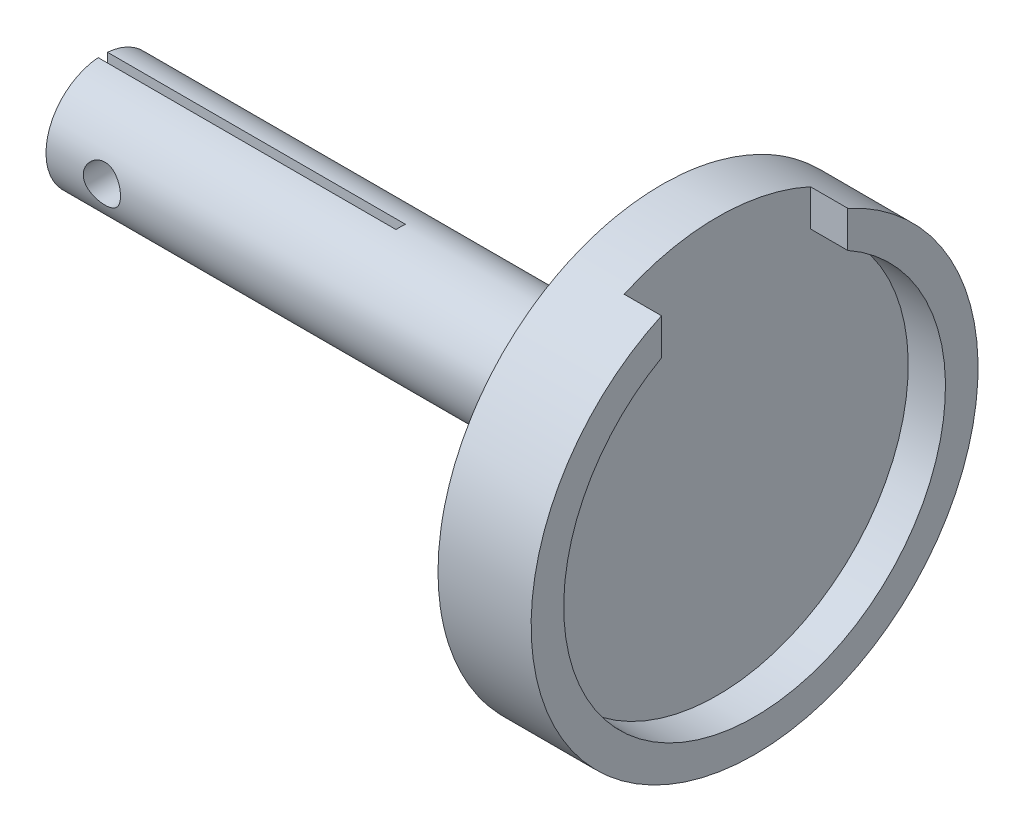
ISO-10303-21;
HEADER;
FILE_DESCRIPTION(('STEP AP214'),'2;1');
FILE_NAME('part.step','',(''),(''),'','','');
FILE_SCHEMA(('AUTOMOTIVE_DESIGN { 1 0 10303 214 1 1 1 1 }'));
ENDSEC;
DATA;
#1=APPLICATION_CONTEXT('core data for automotive mechanical design processes');
#2=APPLICATION_PROTOCOL_DEFINITION('international standard','automotive_design',2000,#1);
#3=PRODUCT_CONTEXT('',#1,'mechanical');
#4=PRODUCT('Part','Part','',(#3));
#5=PRODUCT_RELATED_PRODUCT_CATEGORY('part','',(#4));
#6=PRODUCT_DEFINITION_FORMATION('','',#4);
#7=PRODUCT_DEFINITION_CONTEXT('part definition',#1,'design');
#8=PRODUCT_DEFINITION('design','',#6,#7);
#9=PRODUCT_DEFINITION_SHAPE('','',#8);
#10=(LENGTH_UNIT() NAMED_UNIT(*) SI_UNIT(.MILLI.,.METRE.));
#11=(NAMED_UNIT(*) PLANE_ANGLE_UNIT() SI_UNIT($,.RADIAN.));
#12=(NAMED_UNIT(*) SI_UNIT($,.STERADIAN.) SOLID_ANGLE_UNIT());
#13=UNCERTAINTY_MEASURE_WITH_UNIT(LENGTH_MEASURE(1.E-05),#10,'distance_accuracy_value','');
#14=(GEOMETRIC_REPRESENTATION_CONTEXT(3) GLOBAL_UNCERTAINTY_ASSIGNED_CONTEXT((#13)) GLOBAL_UNIT_ASSIGNED_CONTEXT((#10,
#11,#12)) REPRESENTATION_CONTEXT('',''));
#15=CARTESIAN_POINT('',(0.,0.,0.));
#16=DIRECTION('',(0.,0.,1.));
#17=DIRECTION('',(1.,0.,0.));
#18=AXIS2_PLACEMENT_3D('',#15,#16,#17);
#19=CARTESIAN_POINT('',(35.,0.,0.));
#20=DIRECTION('',(-1.,0.,0.));
#21=DIRECTION('',(0.,0.,1.));
#22=AXIS2_PLACEMENT_3D('',#19,#20,#21);
#23=CYLINDRICAL_SURFACE('',#22,12.);
#24=CARTESIAN_POINT('',(30.,0.,-12.));
#25=CARTESIAN_POINT('',(30.,-1.57079632525588,-12.));
#26=CARTESIAN_POINT('',(30.,-3.14097461373017,-11.687672119433));
#27=CARTESIAN_POINT('',(30.,-6.04342776303202,-10.4854366608379));
#28=CARTESIAN_POINT('',(30.,-7.37456064078693,-9.59600210769022));
#29=CARTESIAN_POINT('',(30.,-9.59600210769027,-7.37456064078688));
#30=CARTESIAN_POINT('',(30.,-10.4854366608379,-6.04342776303051));
#31=CARTESIAN_POINT('',(30.,-11.687672119433,-3.14097461373161));
#32=CARTESIAN_POINT('',(30.,-12.,-1.57079632525766));
#33=CARTESIAN_POINT('',(30.,-12.,1.57079632525762));
#34=CARTESIAN_POINT('',(30.,-11.687672119433,3.14097461373239));
#35=CARTESIAN_POINT('',(30.,-10.4854366608379,6.0434277630298));
#36=CARTESIAN_POINT('',(30.,-9.59600210769122,7.3745606407874));
#37=CARTESIAN_POINT('',(30.,-7.37456064078593,9.59600210768973));
#38=CARTESIAN_POINT('',(30.,-6.04342776303099,10.4854366608399));
#39=CARTESIAN_POINT('',(30.,-3.14097461373114,11.687672119431));
#40=CARTESIAN_POINT('',(30.,-1.57079632525763,12.));
#41=CARTESIAN_POINT('',(30.,1.57079632525764,12.));
#42=CARTESIAN_POINT('',(30.,3.14097461373043,11.687672119431));
#43=CARTESIAN_POINT('',(30.,6.04342776303176,10.4854366608399));
#44=CARTESIAN_POINT('',(30.,7.3745606407874,9.59600210769122));
#45=CARTESIAN_POINT('',(30.,9.59600210768973,7.37456064078593));
#46=CARTESIAN_POINT('',(30.,10.4854366608399,6.04342776303101));
#47=CARTESIAN_POINT('',(30.,11.687672119431,3.14097461373116));
#48=CARTESIAN_POINT('',(30.,12.,1.57079632525764));
#49=CARTESIAN_POINT('',(30.,12.,-1.57079632525764));
#50=CARTESIAN_POINT('',(30.,11.6876721194325,-3.14097461373189));
#51=CARTESIAN_POINT('',(30.,10.4854366608384,-6.04342776303026));
#52=CARTESIAN_POINT('',(30.,9.5960021076927,-7.37456064078593));
#53=CARTESIAN_POINT('',(30.,7.37456064078444,-9.59600210769122));
#54=CARTESIAN_POINT('',(30.,6.043427763031,-10.4854366608399));
#55=CARTESIAN_POINT('',(30.,3.14097461373115,-11.687672119431));
#56=CARTESIAN_POINT('',(30.,1.57079632525587,-12.));
#57=CARTESIAN_POINT('',(30.,0.,-12.));
#58=(BOUNDED_CURVE() B_SPLINE_CURVE(3,(#24,#25,#26,#27,#28,#29,#30,#31,#32,#33,#34,#35,#36,#37,
#38,#39,#40,#41,#42,#43,#44,#45,#46,#47,#48,#49,#50,#51,#52,#53,#54,#55,#56,#57),.UNSPECIFIED.,
.T.,.F.) B_SPLINE_CURVE_WITH_KNOTS((4,2,2,2,2,2,2,2,2,2,2,2,2,2,2,2,4),(0.,0.392699081698725,
0.785398163397448,1.17809724509617,1.5707963267949,1.96349540849362,2.35619449019234,
2.74889357189107,3.14159265358979,3.53429173528852,3.92699081698724,4.31968989868597,
4.71238898038469,5.10508806208341,5.49778714378214,5.89048622548086,6.28318530717959),
.UNSPECIFIED.) CURVE() GEOMETRIC_REPRESENTATION_ITEM() RATIONAL_B_SPLINE_CURVE((1.,1.,1.,1.,1.,
1.,1.,1.,1.,1.,1.,1.,1.,1.,1.,1.,1.,1.,1.,1.,1.,1.,1.,1.,1.,1.,1.,1.,1.,1.,1.,1.,1.,1.)) REPRESENTATION_ITEM(''));
#59=CARTESIAN_POINT('',(30.,0.,-12.));
#60=VERTEX_POINT('',#59);
#61=EDGE_CURVE('E135',#60,#60,#58,.F.);
#62=ORIENTED_EDGE('',*,*,#61,.T.);
#63=EDGE_LOOP('',(#62));
#64=FACE_BOUND('',#63,.T.);
#65=DIRECTION('',(-1.,0.,0.));
#66=VECTOR('',#65,1.);
#67=CARTESIAN_POINT('',(35.,10.9087121146357,-5.));
#68=LINE('',#67,#66);
#69=CARTESIAN_POINT('',(35.,10.9087121146357,-5.));
#70=VERTEX_POINT('',#69);
#71=CARTESIAN_POINT('',(33.,10.9087121146357,-5.));
#72=VERTEX_POINT('',#71);
#73=EDGE_CURVE('E133',#70,#72,#68,.T.);
#74=ORIENTED_EDGE('',*,*,#73,.F.);
#75=CARTESIAN_POINT('',(35.,0.,0.));
#76=DIRECTION('',(1.,0.,0.));
#77=DIRECTION('',(0.,0.,-1.));
#78=AXIS2_PLACEMENT_3D('',#75,#76,#77);
#79=CIRCLE('',#78,12.);
#80=CARTESIAN_POINT('',(35.,10.9087121146357,5.));
#81=VERTEX_POINT('',#80);
#82=EDGE_CURVE('E128',#81,#70,#79,.T.);
#83=ORIENTED_EDGE('',*,*,#82,.F.);
#84=DIRECTION('',(-1.,0.,0.));
#85=VECTOR('',#84,1.);
#86=CARTESIAN_POINT('',(35.,10.9087121146357,5.));
#87=LINE('',#86,#85);
#88=CARTESIAN_POINT('',(33.,10.9087121146357,5.));
#89=VERTEX_POINT('',#88);
#90=EDGE_CURVE('E113',#89,#81,#87,.F.);
#91=ORIENTED_EDGE('',*,*,#90,.F.);
#92=CARTESIAN_POINT('',(33.,0.,0.));
#93=DIRECTION('',(1.,0.,0.));
#94=DIRECTION('',(0.,0.,-1.));
#95=AXIS2_PLACEMENT_3D('',#92,#93,#94);
#96=CIRCLE('',#95,12.);
#97=EDGE_CURVE('E302',#72,#89,#96,.T.);
#98=ORIENTED_EDGE('',*,*,#97,.F.);
#99=EDGE_LOOP('',(#74,#83,#91,#98));
#100=FACE_BOUND('',#99,.T.);
#101=ADVANCED_FACE('F40',(#64,#100),#23,.T.);
#102=CARTESIAN_POINT('',(35.,0.,0.));
#103=DIRECTION('',(1.,0.,0.));
#104=DIRECTION('',(0.,0.,-1.));
#105=AXIS2_PLACEMENT_3D('',#102,#103,#104);
#106=PLANE('',#105);
#107=ORIENTED_EDGE('',*,*,#82,.T.);
#108=DIRECTION('',(0.,-1.,0.));
#109=VECTOR('',#108,1.);
#110=CARTESIAN_POINT('',(35.,27.,-5.));
#111=LINE('',#110,#109);
#112=CARTESIAN_POINT('',(35.,8.94776508408664,-5.));
#113=VERTEX_POINT('',#112);
#114=EDGE_CURVE('E307',#70,#113,#111,.T.);
#115=ORIENTED_EDGE('',*,*,#114,.T.);
#116=CARTESIAN_POINT('',(35.,0.,0.));
#117=DIRECTION('',(1.,0.,0.));
#118=DIRECTION('',(0.,0.,-1.));
#119=AXIS2_PLACEMENT_3D('',#116,#117,#118);
#120=CIRCLE('',#119,10.25);
#121=CARTESIAN_POINT('',(35.,8.94776508408664,5.));
#122=VERTEX_POINT('',#121);
#123=EDGE_CURVE('E130',#122,#113,#120,.T.);
#124=ORIENTED_EDGE('',*,*,#123,.F.);
#125=DIRECTION('',(0.,-1.,0.));
#126=VECTOR('',#125,1.);
#127=CARTESIAN_POINT('',(35.,27.,5.));
#128=LINE('',#127,#126);
#129=EDGE_CURVE('E62',#81,#122,#128,.T.);
#130=ORIENTED_EDGE('',*,*,#129,.F.);
#131=EDGE_LOOP('',(#107,#115,#124,#130));
#132=FACE_BOUND('',#131,.T.);
#133=ADVANCED_FACE('F126',(#132),#106,.T.);
#134=CARTESIAN_POINT('',(33.,0.,0.));
#135=DIRECTION('',(1.,0.,0.));
#136=DIRECTION('',(0.,0.,-1.));
#137=AXIS2_PLACEMENT_3D('',#134,#135,#136);
#138=CYLINDRICAL_SURFACE('',#137,10.25);
#139=DIRECTION('',(1.,0.,0.));
#140=VECTOR('',#139,1.);
#141=CARTESIAN_POINT('',(33.,8.94776508408664,-5.));
#142=LINE('',#141,#140);
#143=CARTESIAN_POINT('',(33.,8.94776508408664,-5.));
#144=VERTEX_POINT('',#143);
#145=EDGE_CURVE('E120',#144,#113,#142,.T.);
#146=ORIENTED_EDGE('',*,*,#145,.F.);
#147=CARTESIAN_POINT('',(33.,0.,0.));
#148=DIRECTION('',(1.,0.,0.));
#149=DIRECTION('',(0.,0.,-1.));
#150=AXIS2_PLACEMENT_3D('',#147,#148,#149);
#151=CIRCLE('',#150,10.25);
#152=CARTESIAN_POINT('',(33.,8.94776508408664,5.));
#153=VERTEX_POINT('',#152);
#154=EDGE_CURVE('E141',#153,#144,#151,.T.);
#155=ORIENTED_EDGE('',*,*,#154,.F.);
#156=DIRECTION('',(1.,0.,0.));
#157=VECTOR('',#156,1.);
#158=CARTESIAN_POINT('',(33.,8.94776508408664,5.));
#159=LINE('',#158,#157);
#160=EDGE_CURVE('E121',#122,#153,#159,.F.);
#161=ORIENTED_EDGE('',*,*,#160,.F.);
#162=ORIENTED_EDGE('',*,*,#123,.T.);
#163=EDGE_LOOP('',(#146,#155,#161,#162));
#164=FACE_BOUND('',#163,.T.);
#165=ADVANCED_FACE('F191',(#164),#138,.F.);
#166=CARTESIAN_POINT('',(30.,0.,0.));
#167=DIRECTION('',(-1.,0.,0.));
#168=DIRECTION('',(0.,0.,1.));
#169=AXIS2_PLACEMENT_3D('',#166,#167,#168);
#170=CYLINDRICAL_SURFACE('',#169,3.05);
#171=CARTESIAN_POINT('',(25.1114930704764,0.,-3.05));
#172=CARTESIAN_POINT('',(25.1114930704764,0.399244066002534,-3.05));
#173=CARTESIAN_POINT('',(25.1114930704764,0.798331047656877,-2.9706166636888));
#174=CARTESIAN_POINT('',(25.1114930704764,1.53603788977017,-2.66504848463005));
#175=CARTESIAN_POINT('',(25.1114930704764,1.87436749619847,-2.43898386903947));
#176=CARTESIAN_POINT('',(25.1114930704764,2.43898386903947,-1.87436749619847));
#177=CARTESIAN_POINT('',(25.1114930704764,2.66504848462992,-1.53603788977048));
#178=CARTESIAN_POINT('',(25.1114930704764,2.97061666368893,-0.798331047656558));
#179=CARTESIAN_POINT('',(25.1114930704764,3.05,-0.399244066002982));
#180=CARTESIAN_POINT('',(25.1114930704764,3.05,0.399244066002982));
#181=CARTESIAN_POINT('',(25.1114930704764,2.97061666368867,0.798331047657195));
#182=CARTESIAN_POINT('',(25.1114930704764,2.66504848463018,1.53603788976986));
#183=CARTESIAN_POINT('',(25.1114930704764,2.43898386903872,1.87436749619921));
#184=CARTESIAN_POINT('',(25.1114930704764,1.87436749619921,2.43898386903873));
#185=CARTESIAN_POINT('',(25.1114930704764,1.53603788977091,2.66504848462974));
#186=CARTESIAN_POINT('',(25.1114930704764,0.79833104765615,2.9706166636891));
#187=CARTESIAN_POINT('',(25.1114930704764,0.399244066002983,3.05));
#188=CARTESIAN_POINT('',(25.1114930704764,-0.399244066002982,3.05));
#189=CARTESIAN_POINT('',(25.1114930704764,-0.798331047656664,2.97061666368889));
#190=CARTESIAN_POINT('',(25.1114930704764,-1.53603788977037,2.66504848462996));
#191=CARTESIAN_POINT('',(25.1114930704764,-1.87436749619921,2.43898386903872));
#192=CARTESIAN_POINT('',(25.1114930704764,-2.43898386903873,1.87436749619921));
#193=CARTESIAN_POINT('',(25.1114930704764,-2.66504848462999,1.53603788977031));
#194=CARTESIAN_POINT('',(25.1114930704764,-2.97061666368886,0.798331047656749));
#195=CARTESIAN_POINT('',(25.1114930704764,-3.05,0.399244066002978));
#196=CARTESIAN_POINT('',(25.1114930704764,-3.05,-0.399244066002987));
#197=CARTESIAN_POINT('',(25.1114930704764,-2.97061666368895,-0.798331047656523));
#198=CARTESIAN_POINT('',(25.1114930704764,-2.66504848462991,-1.53603788977052));
#199=CARTESIAN_POINT('',(25.1114930704764,-2.43898386903814,-1.87436749619979));
#200=CARTESIAN_POINT('',(25.1114930704764,-1.87436749619981,-2.43898386903813));
#201=CARTESIAN_POINT('',(25.1114930704764,-1.53603788977021,-2.66504848463003));
#202=CARTESIAN_POINT('',(25.1114930704764,-0.798331047656848,-2.97061666368881));
#203=CARTESIAN_POINT('',(25.1114930704764,-0.399244066002535,-3.05));
#204=CARTESIAN_POINT('',(25.1114930704764,0.,-3.05));
#205=(BOUNDED_CURVE() B_SPLINE_CURVE(3,(#171,#172,#173,#174,#175,#176,#177,#178,#179,#180,#181,
#182,#183,#184,#185,#186,#187,#188,#189,#190,#191,#192,#193,#194,#195,#196,#197,#198,#199,#200,
#201,#202,#203,#204),.UNSPECIFIED.,.T.,.F.) B_SPLINE_CURVE_WITH_KNOTS((4,2,2,2,2,2,2,2,2,2,2,2,
2,2,2,2,4),(0.,0.392699081698724,0.785398163397448,1.17809724509617,1.5707963267949,
1.96349540849362,2.35619449019234,2.74889357189107,3.14159265358979,3.53429173528852,
3.92699081698724,4.31968989868597,4.71238898038469,5.10508806208341,5.49778714378214,
5.89048622548086,6.28318530717959),
.UNSPECIFIED.) CURVE() GEOMETRIC_REPRESENTATION_ITEM() RATIONAL_B_SPLINE_CURVE((1.,1.,1.,1.,1.,
1.,1.,1.,1.,1.,1.,1.,1.,1.,1.,1.,1.,1.,1.,1.,1.,1.,1.,1.,1.,1.,1.,1.,1.,1.,1.,1.,1.,1.)) REPRESENTATION_ITEM(''));
#206=CARTESIAN_POINT('',(25.1114930704764,0.,-3.05));
#207=VERTEX_POINT('',#206);
#208=EDGE_CURVE('E12',#207,#207,#205,.F.);
#209=ORIENTED_EDGE('',*,*,#208,.T.);
#210=EDGE_LOOP('',(#209));
#211=FACE_BOUND('',#210,.T.);
#212=CARTESIAN_POINT('',(0.,0.,0.));
#213=DIRECTION('',(1.,0.,0.));
#214=DIRECTION('',(0.,0.,-1.));
#215=AXIS2_PLACEMENT_3D('',#212,#213,#214);
#216=CIRCLE('',#215,3.05);
#217=CARTESIAN_POINT('',(0.,3.03973683071413,0.25));
#218=VERTEX_POINT('',#217);
#219=CARTESIAN_POINT('',(0.,3.03973683071413,-0.25));
#220=VERTEX_POINT('',#219);
#221=EDGE_CURVE('E235',#218,#220,#216,.T.);
#222=ORIENTED_EDGE('',*,*,#221,.T.);
#223=DIRECTION('',(-1.,0.,0.));
#224=VECTOR('',#223,1.);
#225=CARTESIAN_POINT('',(30.,3.03973683071413,-0.25));
#226=LINE('',#225,#224);
#227=CARTESIAN_POINT('',(16.,3.03973683071413,-0.25));
#228=VERTEX_POINT('',#227);
#229=EDGE_CURVE('E238',#220,#228,#226,.F.);
#230=ORIENTED_EDGE('',*,*,#229,.T.);
#231=CARTESIAN_POINT('',(16.,0.,0.));
#232=DIRECTION('',(-1.,0.,0.));
#233=DIRECTION('',(0.,0.,1.));
#234=AXIS2_PLACEMENT_3D('',#231,#232,#233);
#235=CIRCLE('',#234,3.05);
#236=CARTESIAN_POINT('',(16.,3.03973683071413,0.25));
#237=VERTEX_POINT('',#236);
#238=EDGE_CURVE('E55',#237,#228,#235,.T.);
#239=ORIENTED_EDGE('',*,*,#238,.F.);
#240=DIRECTION('',(-1.,0.,0.));
#241=VECTOR('',#240,1.);
#242=CARTESIAN_POINT('',(30.,3.03973683071413,0.25));
#243=LINE('',#242,#241);
#244=EDGE_CURVE('E241',#237,#218,#243,.T.);
#245=ORIENTED_EDGE('',*,*,#244,.T.);
#246=EDGE_LOOP('',(#222,#230,#239,#245));
#247=FACE_BOUND('',#246,.T.);
#248=CARTESIAN_POINT('',(3.,-1.00513158464293,-2.87961985295858));
#249=CARTESIAN_POINT('',(2.94549597035119,-1.00513166724251,-2.87961982470852));
#250=CARTESIAN_POINT('',(2.89099207979804,-1.00066042307044,-2.88119219888025));
#251=CARTESIAN_POINT('',(2.78359607493865,-0.982951963020422,-2.88728090255156));
#252=CARTESIAN_POINT('',(2.73070427447741,-0.969713051493951,-2.89179780151342));
#253=CARTESIAN_POINT('',(2.62810571020994,-0.934982848309444,-2.90321156367945));
#254=CARTESIAN_POINT('',(2.57839302780224,-0.91350744532338,-2.91010384205867));
#255=CARTESIAN_POINT('',(2.48326108773233,-0.862968339079333,-2.92548814050529));
#256=CARTESIAN_POINT('',(2.43784273595442,-0.833903039583945,-2.93398049698169));
#257=CARTESIAN_POINT('',(2.35085341417011,-0.767820601515097,-2.95197588637567));
#258=CARTESIAN_POINT('',(2.30947043569096,-0.730562701336779,-2.96150375213242));
#259=CARTESIAN_POINT('',(2.23341236626205,-0.649667427895264,-2.98029435868337));
#260=CARTESIAN_POINT('',(2.19873833458106,-0.606029049131326,-2.98955705741423));
#261=CARTESIAN_POINT('',(2.13622423459713,-0.512228850606815,-3.00706703815949));
#262=CARTESIAN_POINT('',(2.10858254648439,-0.46192827790856,-3.0152821327917));
#263=CARTESIAN_POINT('',(2.06222701137103,-0.357076090745735,-3.02948683280831));
#264=CARTESIAN_POINT('',(2.04351085202479,-0.302525581581626,-3.0354770145141));
#265=CARTESIAN_POINT('',(2.01616822004823,-0.192668978472822,-3.04439024941703));
#266=CARTESIAN_POINT('',(2.00722339356719,-0.137450093074328,-3.04740973730578));
#267=CARTESIAN_POINT('',(1.99866853567068,-0.0262177795436076,-3.05039419763753));
#268=CARTESIAN_POINT('',(1.99905614721971,0.0297954443957818,-3.05035994133968));
#269=CARTESIAN_POINT('',(2.00895158532831,0.138746448748743,-3.04731157268238));
#270=CARTESIAN_POINT('',(2.0181091030853,0.191719795382586,-3.04441178117238));
#271=CARTESIAN_POINT('',(2.04470849241183,0.295334169345902,-3.03611273863335));
#272=CARTESIAN_POINT('',(2.06215090250623,0.345975044828057,-3.0307133251274));
#273=CARTESIAN_POINT('',(2.10502295472471,0.444229642311097,-3.01788791702512));
#274=CARTESIAN_POINT('',(2.13054923512903,0.491797883065166,-3.01043755325361));
#275=CARTESIAN_POINT('',(2.18878520216414,0.582080666824855,-2.99429265401132));
#276=CARTESIAN_POINT('',(2.22149682599593,0.624793896175931,-2.98559778323651));
#277=CARTESIAN_POINT('',(2.29492042106559,0.706206553560568,-2.96742173503027));
#278=CARTESIAN_POINT('',(2.33592831970621,0.744635503516695,-2.95792278088868));
#279=CARTESIAN_POINT('',(2.42388604705218,0.814158239872629,-2.93954803858875));
#280=CARTESIAN_POINT('',(2.47083673264953,0.845250966605064,-2.93067234058539));
#281=CARTESIAN_POINT('',(2.57019496809761,0.899587100731472,-2.91445728668923));
#282=CARTESIAN_POINT('',(2.6226682667742,0.922717549562088,-2.90714056012349));
#283=CARTESIAN_POINT('',(2.73106245365029,0.959725285965181,-2.89513562940463));
#284=CARTESIAN_POINT('',(2.78698196251789,0.973606249665906,-2.89044638110094));
#285=CARTESIAN_POINT('',(2.8980912894925,0.991181790951132,-2.88446557245529));
#286=CARTESIAN_POINT('',(2.95320812859812,0.995290827084138,-2.88303587940632));
#287=CARTESIAN_POINT('',(3.06335113831373,0.994377450223513,-2.88335121704284));
#288=CARTESIAN_POINT('',(3.1183773229611,0.989356617014337,-2.88509569848594));
#289=CARTESIAN_POINT('',(3.22490853255726,0.970699452695871,-2.89142406116211));
#290=CARTESIAN_POINT('',(3.27646986841007,0.957349224323589,-2.89591355650253));
#291=CARTESIAN_POINT('',(3.37661184906278,0.922753780108491,-2.9071212267378));
#292=CARTESIAN_POINT('',(3.42519197732271,0.901507200576422,-2.91383978656758));
#293=CARTESIAN_POINT('',(3.51964051188144,0.850981512795522,-2.92900059957563));
#294=CARTESIAN_POINT('',(3.56538034241094,0.82147637504844,-2.93748933184412));
#295=CARTESIAN_POINT('',(3.65141102142154,0.755528163955249,-2.95513798395867));
#296=CARTESIAN_POINT('',(3.69170032193489,0.719083126701394,-2.96429809334391));
#297=CARTESIAN_POINT('',(3.76759016629371,0.638307648648085,-2.98275944950205));
#298=CARTESIAN_POINT('',(3.80289186473326,0.593692728701855,-2.99204798006602));
#299=CARTESIAN_POINT('',(3.86552451989319,0.498943357427558,-3.00929740108202));
#300=CARTESIAN_POINT('',(3.89285580880323,0.448809136252187,-3.01725834685903));
#301=CARTESIAN_POINT('',(3.93851005240919,0.344730697326772,-3.03090622756889));
#302=CARTESIAN_POINT('',(3.95689648556554,0.290816529085555,-3.03660913153469));
#303=CARTESIAN_POINT('',(3.98427293661498,0.180440058420558,-3.04516012031907));
#304=CARTESIAN_POINT('',(3.99326620894833,0.123978645615967,-3.04800919388776));
#305=CARTESIAN_POINT('',(4.00131784746461,0.012867071453746,-3.05045616259236));
#306=CARTESIAN_POINT('',(4.00080859656403,-0.0417489902437638,-3.0501957477278));
#307=CARTESIAN_POINT('',(3.99093306184365,-0.150077298192969,-3.04678733205802));
#308=CARTESIAN_POINT('',(3.98156743496727,-0.203789611181667,-3.04363954543119));
#309=CARTESIAN_POINT('',(3.95452546718122,-0.308016029385854,-3.03485167149046));
#310=CARTESIAN_POINT('',(3.93697145480329,-0.358565187686155,-3.02924834042412));
#311=CARTESIAN_POINT('',(3.89416650390139,-0.456019917583154,-3.01611774506934));
#312=CARTESIAN_POINT('',(3.86891417571458,-0.502924829418172,-3.0085901334587));
#313=CARTESIAN_POINT('',(3.81036574394545,-0.593626842910554,-2.99204127377414));
#314=CARTESIAN_POINT('',(3.77680944120207,-0.637247763506862,-2.98297549951648));
#315=CARTESIAN_POINT('',(3.70305231878256,-0.718381219325374,-2.96448362711988));
#316=CARTESIAN_POINT('',(3.6628494034088,-0.755891820515388,-2.95505741605699));
#317=CARTESIAN_POINT('',(3.57513417399314,-0.825167588430484,-2.93648338957373));
#318=CARTESIAN_POINT('',(3.52740420815925,-0.856664383235488,-2.92735928904023));
#319=CARTESIAN_POINT('',(3.42704376739014,-0.911162174203269,-2.91085869793583));
#320=CARTESIAN_POINT('',(3.3744147963758,-0.934165766952142,-2.90348167348743));
#321=CARTESIAN_POINT('',(3.26879662402627,-0.969847554108903,-2.89175207849726));
#322=CARTESIAN_POINT('',(3.21599667065257,-0.983036788893566,-2.88725186694306));
#323=CARTESIAN_POINT('',(3.10879742106876,-1.00067736769108,-2.88118623688995));
#324=CARTESIAN_POINT('',(3.05439864125524,-1.00513150220308,-2.87961988115401));
#325=CARTESIAN_POINT('',(3.,-1.00513158464293,-2.87961985295858));
#326=B_SPLINE_CURVE_WITH_KNOTS('',3,(#248,#249,#250,#251,#252,#253,#254,#255,#256,#257,#258,
#259,#260,#261,#262,#263,#264,#265,#266,#267,#268,#269,#270,#271,#272,#273,#274,#275,#276,#277,
#278,#279,#280,#281,#282,#283,#284,#285,#286,#287,#288,#289,#290,#291,#292,#293,#294,#295,#296,
#297,#298,#299,#300,#301,#302,#303,#304,#305,#306,#307,#308,#309,#310,#311,#312,#313,#314,#315,
#316,#317,#318,#319,#320,#321,#322,#323,#324,#325),.UNSPECIFIED.,.T.,.F.,(4,2,2,2,2,2,2,2,2,2,2,
2,2,2,2,2,2,2,2,2,2,2,2,2,2,2,2,2,2,2,2,2,2,2,2,2,2,2,4),(0.,0.163310690589457,
0.326652974351479,0.489681733423415,0.65274480686089,0.821461499346943,0.990204808640642,
1.16328179458683,1.3363139169142,1.50352294747035,1.67068974753051,1.8314460938282,
1.99221289085197,2.15497912429985,2.31778929423739,2.48799543306749,2.65822614198248,
2.83078093219217,3.00326710101571,3.16829588124419,3.33329610847986,3.49291914449885,
3.65256976002136,3.8171087334384,3.98169433878188,4.153809868498,4.32591822378062,
4.49678669349977,4.66759594291103,4.83065279860946,4.99369756011431,5.15438094525258,
5.31509335337297,5.48167808397501,5.64831543978477,5.82120498353801,5.99404162674291,
6.15708863676273,6.32008355159314),.UNSPECIFIED.);
#327=CARTESIAN_POINT('',(3.,-1.00513158464293,-2.87961985295858));
#328=VERTEX_POINT('',#327);
#329=EDGE_CURVE('E147',#328,#328,#326,.T.);
#330=ORIENTED_EDGE('',*,*,#329,.F.);
#331=EDGE_LOOP('',(#330));
#332=FACE_BOUND('',#331,.T.);
#333=CARTESIAN_POINT('',(3.99998683333285,0.,3.05));
#334=CARTESIAN_POINT('',(3.99970658682409,0.0546261070997252,3.05000002875027));
#335=CARTESIAN_POINT('',(3.99493549231713,0.109229089941042,3.04851883907038));
#336=CARTESIAN_POINT('',(3.97659143335726,0.216783790506008,3.04276309519239));
#337=CARTESIAN_POINT('',(3.96301723104305,0.269735274904211,3.03848814814554));
#338=CARTESIAN_POINT('',(3.92757722855279,0.372422121069229,3.02761718205127));
#339=CARTESIAN_POINT('',(3.90572506609854,0.422162615950876,3.02102498189799));
#340=CARTESIAN_POINT('',(3.85440720691274,0.517276474473661,3.00620109622625));
#341=CARTESIAN_POINT('',(3.82494009169658,0.562649022306544,2.99796910531933));
#342=CARTESIAN_POINT('',(3.75818595317107,0.649263978655809,2.98043107646347));
#343=CARTESIAN_POINT('',(3.72068891915631,0.690339449934592,2.97110004107037));
#344=CARTESIAN_POINT('',(3.63939481902737,0.765743937867106,2.95256615218151));
#345=CARTESIAN_POINT('',(3.59559646177916,0.800071568476534,2.94336332538044));
#346=CARTESIAN_POINT('',(3.5014940378631,0.861907651834772,2.92586370761712));
#347=CARTESIAN_POINT('',(3.45104636760006,0.889207216441934,2.91759804731603));
#348=CARTESIAN_POINT('',(3.34596075613364,0.934863184311807,2.90329253538347));
#349=CARTESIAN_POINT('',(3.29132406564123,0.953222244988242,2.8972520224947));
#350=CARTESIAN_POINT('',(3.18131646941955,0.979865960174033,2.88834821244282));
#351=CARTESIAN_POINT('',(3.12602957089306,0.988463645726521,2.88538646700128));
#352=CARTESIAN_POINT('',(3.01472504115815,0.996314071857177,2.88268577689047));
#353=CARTESIAN_POINT('',(2.95870762447796,0.995569496837934,2.88294590644824));
#354=CARTESIAN_POINT('',(2.85009081862807,0.985008250476519,2.88656985485702));
#355=CARTESIAN_POINT('',(2.79744810411869,0.975583535730331,2.88979956994054));
#356=CARTESIAN_POINT('',(2.69453466867137,0.948557207584742,2.89878250222305));
#357=CARTESIAN_POINT('',(2.64426423227978,0.930954616010311,2.90453602129557));
#358=CARTESIAN_POINT('',(2.54655338204563,0.887777749803766,2.91802463755303));
#359=CARTESIAN_POINT('',(2.49917382252849,0.862075957334719,2.92579105281901));
#360=CARTESIAN_POINT('',(2.40927029415156,0.803520579478015,2.94241039018524));
#361=CARTESIAN_POINT('',(2.366747691946,0.770664988670392,2.95126361664645));
#362=CARTESIAN_POINT('',(2.28554292118282,0.696802003320937,2.96959305651458));
#363=CARTESIAN_POINT('',(2.24715718424968,0.655470301215035,2.97907834727077));
#364=CARTESIAN_POINT('',(2.17779022590932,0.566828633104411,2.99720689649346));
#365=CARTESIAN_POINT('',(2.14680958587103,0.519518198159061,3.00585008881587));
#366=CARTESIAN_POINT('',(2.09295096540414,0.419722322970331,3.02140694438405));
#367=CARTESIAN_POINT('',(2.07013855627978,0.367199145261479,3.02830648598034));
#368=CARTESIAN_POINT('',(2.03376186345821,0.258781650849247,3.03948949339313));
#369=CARTESIAN_POINT('',(2.0201944584212,0.202888478882726,3.04377384211186));
#370=CARTESIAN_POINT('',(2.00319955430448,0.0918641436700084,3.04910122653182));
#371=CARTESIAN_POINT('',(1.9993664485332,0.0368011828012197,3.05027401268191));
#372=CARTESIAN_POINT('',(2.00080409649327,-0.0731823790737107,3.04961749528811));
#373=CARTESIAN_POINT('',(2.00607344713411,-0.12810300071375,3.04778865442967));
#374=CARTESIAN_POINT('',(2.02524625150666,-0.234722113283185,3.04141160727562));
#375=CARTESIAN_POINT('',(2.03891591578339,-0.286467466419549,3.03693715458451));
#376=CARTESIAN_POINT('',(2.07421426698491,-0.386911298465991,3.02578179321074));
#377=CARTESIAN_POINT('',(2.0958440061491,-0.435609373561261,3.01910059283087));
#378=CARTESIAN_POINT('',(2.14710048461839,-0.530037492504769,3.00398232663019));
#379=CARTESIAN_POINT('',(2.17692737385713,-0.575651899424344,2.99550272323986));
#380=CARTESIAN_POINT('',(2.24348848925348,-0.661360614879665,2.97775434820194));
#381=CARTESIAN_POINT('',(2.2802247805645,-0.701453266793915,2.96848534106362));
#382=CARTESIAN_POINT('',(2.36146412032668,-0.776800535086621,2.94968740271156));
#383=CARTESIAN_POINT('',(2.4062364538998,-0.811767104780348,2.94016481770318));
#384=CARTESIAN_POINT('',(2.50122923582964,-0.873718073940646,2.92235509377284));
#385=CARTESIAN_POINT('',(2.55144962229901,-0.900702564066945,2.91406794081949));
#386=CARTESIAN_POINT('',(2.65581815091703,-0.945745693963259,2.89976287980141));
#387=CARTESIAN_POINT('',(2.70994965170562,-0.963839860387347,2.89373596285648));
#388=CARTESIAN_POINT('',(2.82073342632621,-0.990579071564432,2.88469346546522));
#389=CARTESIAN_POINT('',(2.8773845907813,-0.999228232803899,2.88167657318711));
#390=CARTESIAN_POINT('',(2.98852365029662,-1.00653677396279,2.87913126047586));
#391=CARTESIAN_POINT('',(3.04297640203924,-1.00567835937074,2.87943444320724));
#392=CARTESIAN_POINT('',(3.15091678066527,-0.995163980344742,2.88308496685565));
#393=CARTESIAN_POINT('',(3.20440445468435,-0.985508446766351,2.88643215868657));
#394=CARTESIAN_POINT('',(3.30800940202035,-0.957998838088086,2.89567641927919));
#395=CARTESIAN_POINT('',(3.3581682467579,-0.940285467969893,2.90152962908213));
#396=CARTESIAN_POINT('',(3.45484428202498,-0.897273689576541,2.91511685692755));
#397=CARTESIAN_POINT('',(3.50136066501965,-0.871973605295084,2.92285129048605));
#398=CARTESIAN_POINT('',(3.59161881622019,-0.813222724721702,2.93975178247771));
#399=CARTESIAN_POINT('',(3.63515220701176,-0.779465542333768,2.94896544337871));
#400=CARTESIAN_POINT('',(3.71609030301622,-0.705295399000408,2.96757788410296));
#401=CARTESIAN_POINT('',(3.75349329405162,-0.664880582765278,2.97697671488308));
#402=CARTESIAN_POINT('',(3.82250058460104,-0.576742545743023,2.99532388366516));
#403=CARTESIAN_POINT('',(3.85383870115957,-0.528804026964685,3.00424262934465));
#404=CARTESIAN_POINT('',(3.90797102540196,-0.428045899467075,3.02024392324674));
#405=CARTESIAN_POINT('',(3.93076780375818,-0.375227765333011,3.02732702374222));
#406=CARTESIAN_POINT('',(3.96600158706643,-0.269288036834659,3.03852897521557));
#407=CARTESIAN_POINT('',(3.97895133522653,-0.216352349016057,3.04279274781204));
#408=CARTESIAN_POINT('',(3.99608254056136,-0.108936518172093,3.04852789343961));
#409=CARTESIAN_POINT('',(4.00026621108954,-0.0544567685299346,3.04999997133886));
#410=CARTESIAN_POINT('',(3.99998683333285,0.,3.05));
#411=B_SPLINE_CURVE_WITH_KNOTS('',3,(#333,#334,#335,#336,#337,#338,#339,#340,#341,#342,#343,
#344,#345,#346,#347,#348,#349,#350,#351,#352,#353,#354,#355,#356,#357,#358,#359,#360,#361,#362,
#363,#364,#365,#366,#367,#368,#369,#370,#371,#372,#373,#374,#375,#376,#377,#378,#379,#380,#381,
#382,#383,#384,#385,#386,#387,#388,#389,#390,#391,#392,#393,#394,#395,#396,#397,#398,#399,#400,
#401,#402,#403,#404,#405,#406,#407,#408,#409,#410),.UNSPECIFIED.,.T.,.F.,(4,2,2,2,2,2,2,2,2,2,2,
2,2,2,2,2,2,2,2,2,2,2,2,2,2,2,2,2,2,2,2,2,2,2,2,2,2,2,4),(0.,0.163680029514569,
0.327383080117384,0.490817598958576,0.654282583736583,0.822703834487743,0.991159643841435,
1.1641588161778,1.3371065360003,1.50433588277316,1.67151717901211,1.83150090092063,
1.99150376378614,2.15416350738022,2.31686890812407,2.48767140100725,2.65848729907197,
2.83064522201695,3.00274499139273,3.16754647430986,3.33232255630751,3.4927083132177,
3.65311527908275,3.81785320976481,3.9826404574939,4.15463009303312,4.32661777505479,
4.49791247055746,4.6691324795927,4.83171002784084,4.99427961397379,5.15411337124044,
5.3139824639599,5.48079791580237,5.64765993316379,5.82070415429958,5.99369625268804,
6.15691009614196,6.32008272464311),.UNSPECIFIED.);
#412=CARTESIAN_POINT('',(3.99998683333285,0.,3.05));
#413=VERTEX_POINT('',#412);
#414=EDGE_CURVE('E154',#413,#413,#411,.T.);
#415=ORIENTED_EDGE('',*,*,#414,.F.);
#416=EDGE_LOOP('',(#415));
#417=FACE_BOUND('',#416,.T.);
#418=ADVANCED_FACE('F159',(#211,#247,#332,#417),#170,.T.);
#419=CARTESIAN_POINT('',(0.,0.,0.));
#420=DIRECTION('',(1.,0.,0.));
#421=DIRECTION('',(0.,0.,-1.));
#422=AXIS2_PLACEMENT_3D('',#419,#420,#421);
#423=PLANE('',#422);
#424=DIRECTION('',(0.,0.,1.));
#425=VECTOR('',#424,1.);
#426=CARTESIAN_POINT('',(0.,-2.59236932889197,-0.25));
#427=LINE('',#426,#425);
#428=CARTESIAN_POINT('',(0.,-2.59236932889197,-0.25));
#429=VERTEX_POINT('',#428);
#430=CARTESIAN_POINT('',(0.,-2.59236932889197,0.25));
#431=VERTEX_POINT('',#430);
#432=EDGE_CURVE('E251',#429,#431,#427,.T.);
#433=ORIENTED_EDGE('',*,*,#432,.F.);
#434=DIRECTION('',(0.,1.,0.));
#435=VECTOR('',#434,1.);
#436=CARTESIAN_POINT('',(0.,0.,-0.25));
#437=LINE('',#436,#435);
#438=EDGE_CURVE('E232',#429,#220,#437,.T.);
#439=ORIENTED_EDGE('',*,*,#438,.T.);
#440=ORIENTED_EDGE('',*,*,#221,.F.);
#441=DIRECTION('',(0.,1.,0.));
#442=VECTOR('',#441,1.);
#443=CARTESIAN_POINT('',(0.,3.86196678721204,0.25));
#444=LINE('',#443,#442);
#445=EDGE_CURVE('E248',#431,#218,#444,.T.);
#446=ORIENTED_EDGE('',*,*,#445,.F.);
#447=EDGE_LOOP('',(#433,#439,#440,#446));
#448=FACE_BOUND('',#447,.T.);
#449=ADVANCED_FACE('F176',(#448),#423,.F.);
#450=CARTESIAN_POINT('',(16.,0.,0.));
#451=DIRECTION('',(-1.,0.,0.));
#452=DIRECTION('',(0.,0.,1.));
#453=AXIS2_PLACEMENT_3D('',#450,#451,#452);
#454=PLANE('',#453);
#455=ORIENTED_EDGE('',*,*,#238,.T.);
#456=DIRECTION('',(0.,-1.,0.));
#457=VECTOR('',#456,1.);
#458=CARTESIAN_POINT('',(16.,3.86196678721204,-0.25));
#459=LINE('',#458,#457);
#460=CARTESIAN_POINT('',(16.,-2.59236932889197,-0.25));
#461=VERTEX_POINT('',#460);
#462=EDGE_CURVE('E250',#228,#461,#459,.T.);
#463=ORIENTED_EDGE('',*,*,#462,.T.);
#464=DIRECTION('',(0.,0.,1.));
#465=VECTOR('',#464,1.);
#466=CARTESIAN_POINT('',(16.,-2.59236932889197,-0.25));
#467=LINE('',#466,#465);
#468=CARTESIAN_POINT('',(16.,-2.59236932889197,0.25));
#469=VERTEX_POINT('',#468);
#470=EDGE_CURVE('E255',#461,#469,#467,.T.);
#471=ORIENTED_EDGE('',*,*,#470,.T.);
#472=DIRECTION('',(0.,1.,0.));
#473=VECTOR('',#472,1.);
#474=CARTESIAN_POINT('',(16.,3.86196678721204,0.25));
#475=LINE('',#474,#473);
#476=EDGE_CURVE('E246',#469,#237,#475,.T.);
#477=ORIENTED_EDGE('',*,*,#476,.T.);
#478=EDGE_LOOP('',(#455,#463,#471,#477));
#479=FACE_BOUND('',#478,.T.);
#480=ADVANCED_FACE('F171',(#479),#454,.T.);
#481=CARTESIAN_POINT('',(16.,3.86196678721204,-0.25));
#482=DIRECTION('',(0.,0.,-1.));
#483=DIRECTION('',(-1.,0.,0.));
#484=AXIS2_PLACEMENT_3D('',#481,#482,#483);
#485=PLANE('',#484);
#486=CARTESIAN_POINT('',(3.,-0.00513158464293418,-0.25));
#487=DIRECTION('',(0.,0.,-1.));
#488=DIRECTION('',(-1.,0.,0.));
#489=AXIS2_PLACEMENT_3D('',#486,#487,#488);
#490=CIRCLE('',#489,1.);
#491=CARTESIAN_POINT('',(2.,-0.00513158464293418,-0.25));
#492=VERTEX_POINT('',#491);
#493=EDGE_CURVE('E138',#492,#492,#490,.F.);
#494=ORIENTED_EDGE('',*,*,#493,.F.);
#495=EDGE_LOOP('',(#494));
#496=FACE_BOUND('',#495,.T.);
#497=ORIENTED_EDGE('',*,*,#438,.F.);
#498=DIRECTION('',(-1.,0.,0.));
#499=VECTOR('',#498,1.);
#500=CARTESIAN_POINT('',(16.,-2.59236932889197,-0.25));
#501=LINE('',#500,#499);
#502=EDGE_CURVE('E70',#461,#429,#501,.T.);
#503=ORIENTED_EDGE('',*,*,#502,.F.);
#504=ORIENTED_EDGE('',*,*,#462,.F.);
#505=ORIENTED_EDGE('',*,*,#229,.F.);
#506=EDGE_LOOP('',(#497,#503,#504,#505));
#507=FACE_BOUND('',#506,.T.);
#508=ADVANCED_FACE('F175',(#496,#507),#485,.F.);
#509=CARTESIAN_POINT('',(16.,3.86196678721204,0.25));
#510=DIRECTION('',(0.,0.,1.));
#511=DIRECTION('',(1.,0.,0.));
#512=AXIS2_PLACEMENT_3D('',#509,#510,#511);
#513=PLANE('',#512);
#514=CARTESIAN_POINT('',(3.,-0.00513158464293412,0.25));
#515=DIRECTION('',(0.,0.,1.));
#516=DIRECTION('',(1.,0.,0.));
#517=AXIS2_PLACEMENT_3D('',#514,#515,#516);
#518=CIRCLE('',#517,1.);
#519=CARTESIAN_POINT('',(4.,-0.00513158464293412,0.25));
#520=VERTEX_POINT('',#519);
#521=EDGE_CURVE('E134',#520,#520,#518,.F.);
#522=ORIENTED_EDGE('',*,*,#521,.F.);
#523=EDGE_LOOP('',(#522));
#524=FACE_BOUND('',#523,.T.);
#525=ORIENTED_EDGE('',*,*,#476,.F.);
#526=DIRECTION('',(-1.,0.,0.));
#527=VECTOR('',#526,1.);
#528=CARTESIAN_POINT('',(16.,-2.59236932889197,0.25));
#529=LINE('',#528,#527);
#530=EDGE_CURVE('E244',#469,#431,#529,.T.);
#531=ORIENTED_EDGE('',*,*,#530,.T.);
#532=ORIENTED_EDGE('',*,*,#445,.T.);
#533=ORIENTED_EDGE('',*,*,#244,.F.);
#534=EDGE_LOOP('',(#525,#531,#532,#533));
#535=FACE_BOUND('',#534,.T.);
#536=ADVANCED_FACE('F178',(#524,#535),#513,.F.);
#537=CARTESIAN_POINT('',(16.,-2.59236932889197,-0.25));
#538=DIRECTION('',(0.,-1.,0.));
#539=DIRECTION('',(0.,0.,-1.));
#540=AXIS2_PLACEMENT_3D('',#537,#538,#539);
#541=PLANE('',#540);
#542=ORIENTED_EDGE('',*,*,#432,.T.);
#543=ORIENTED_EDGE('',*,*,#530,.F.);
#544=ORIENTED_EDGE('',*,*,#470,.F.);
#545=ORIENTED_EDGE('',*,*,#502,.T.);
#546=EDGE_LOOP('',(#542,#543,#544,#545));
#547=FACE_BOUND('',#546,.T.);
#548=ADVANCED_FACE('F167',(#547),#541,.F.);
#549=CARTESIAN_POINT('',(3.,-0.00513158464293532,-9.75));
#550=DIRECTION('',(0.,0.,1.));
#551=DIRECTION('',(0.,-1.,0.));
#552=AXIS2_PLACEMENT_3D('',#549,#550,#551);
#553=CYLINDRICAL_SURFACE('',#552,1.);
#554=ORIENTED_EDGE('',*,*,#521,.T.);
#555=EDGE_LOOP('',(#554));
#556=FACE_BOUND('',#555,.T.);
#557=ORIENTED_EDGE('',*,*,#414,.T.);
#558=EDGE_LOOP('',(#557));
#559=FACE_BOUND('',#558,.T.);
#560=ADVANCED_FACE('F162',(#556,#559),#553,.F.);
#561=ORIENTED_EDGE('',*,*,#493,.T.);
#562=EDGE_LOOP('',(#561));
#563=FACE_BOUND('',#562,.T.);
#564=ORIENTED_EDGE('',*,*,#329,.T.);
#565=EDGE_LOOP('',(#564));
#566=FACE_BOUND('',#565,.T.);
#567=ADVANCED_FACE('F166',(#563,#566),#553,.F.);
#568=CARTESIAN_POINT('',(30.,0.,-12.));
#569=CARTESIAN_POINT('',(30.,1.57079632525587,-12.));
#570=CARTESIAN_POINT('',(30.,3.14097461373115,-11.687672119431));
#571=CARTESIAN_POINT('',(30.,6.043427763031,-10.4854366608399));
#572=CARTESIAN_POINT('',(30.,7.37456064078444,-9.59600210769122));
#573=CARTESIAN_POINT('',(30.,9.5960021076927,-7.37456064078593));
#574=CARTESIAN_POINT('',(30.,10.4854366608384,-6.04342776303026));
#575=CARTESIAN_POINT('',(30.,11.6876721194325,-3.14097461373189));
#576=CARTESIAN_POINT('',(30.,12.,-1.57079632525764));
#577=CARTESIAN_POINT('',(30.,12.,1.57079632525764));
#578=CARTESIAN_POINT('',(30.,11.687672119431,3.14097461373116));
#579=CARTESIAN_POINT('',(30.,10.4854366608399,6.04342776303101));
#580=CARTESIAN_POINT('',(30.,9.59600210768973,7.37456064078593));
#581=CARTESIAN_POINT('',(30.,7.3745606407874,9.59600210769122));
#582=CARTESIAN_POINT('',(30.,6.04342776303176,10.4854366608399));
#583=CARTESIAN_POINT('',(30.,3.14097461373043,11.687672119431));
#584=CARTESIAN_POINT('',(30.,1.57079632525764,12.));
#585=CARTESIAN_POINT('',(30.,-1.57079632525763,12.));
#586=CARTESIAN_POINT('',(30.,-3.14097461373114,11.687672119431));
#587=CARTESIAN_POINT('',(30.,-6.04342776303099,10.4854366608399));
#588=CARTESIAN_POINT('',(30.,-7.37456064078593,9.59600210768973));
#589=CARTESIAN_POINT('',(30.,-9.59600210769122,7.3745606407874));
#590=CARTESIAN_POINT('',(30.,-10.4854366608379,6.0434277630298));
#591=CARTESIAN_POINT('',(30.,-11.687672119433,3.14097461373239));
#592=CARTESIAN_POINT('',(30.,-12.,1.57079632525762));
#593=CARTESIAN_POINT('',(30.,-12.,-1.57079632525766));
#594=CARTESIAN_POINT('',(30.,-11.687672119433,-3.14097461373161));
#595=CARTESIAN_POINT('',(30.,-10.4854366608379,-6.04342776303051));
#596=CARTESIAN_POINT('',(30.,-9.59600210769027,-7.37456064078688));
#597=CARTESIAN_POINT('',(30.,-7.37456064078693,-9.59600210769022));
#598=CARTESIAN_POINT('',(30.,-6.04342776303202,-10.4854366608379));
#599=CARTESIAN_POINT('',(30.,-3.14097461373017,-11.687672119433));
#600=CARTESIAN_POINT('',(30.,-1.57079632525588,-12.));
#601=CARTESIAN_POINT('',(30.,0.,-12.));
#602=CARTESIAN_POINT('',(28.0776339001905,0.,-3.05));
#603=CARTESIAN_POINT('',(28.0776339001905,0.399244066002534,-3.05));
#604=CARTESIAN_POINT('',(28.0776339001905,0.798331047656433,-2.97061666368803));
#605=CARTESIAN_POINT('',(28.0776339001905,1.53603788977061,-2.66504848463081));
#606=CARTESIAN_POINT('',(28.0776339001875,1.87436749619996,-2.43898386904095));
#607=CARTESIAN_POINT('',(28.0776339001935,2.43898386903799,-1.87436749619699));
#608=CARTESIAN_POINT('',(28.0776339001905,2.66504848462933,-1.53603788977061));
#609=CARTESIAN_POINT('',(28.0776339001905,2.97061666368952,-0.798331047656431));
#610=CARTESIAN_POINT('',(28.0776339001905,3.05,-0.399244066002982));
#611=CARTESIAN_POINT('',(28.0776339001905,3.05,0.399244066002982));
#612=CARTESIAN_POINT('',(28.0776339001846,2.97061666368952,0.798331047657176));
#613=CARTESIAN_POINT('',(28.0776339001964,2.66504848462933,1.53603788976987));
#614=CARTESIAN_POINT('',(28.0776339001905,2.43898386903947,1.87436749619921));
#615=CARTESIAN_POINT('',(28.0776339001905,1.87436749619847,2.43898386903873));
#616=CARTESIAN_POINT('',(28.0776339001994,1.53603788976988,2.66504848462785));
#617=CARTESIAN_POINT('',(28.0776339001816,0.798331047657177,2.970616663691));
#618=CARTESIAN_POINT('',(28.0776339001905,0.399244066002983,3.05));
#619=CARTESIAN_POINT('',(28.0776339001905,-0.399244066002982,3.05));
#620=CARTESIAN_POINT('',(28.0776339001846,-0.798331047657169,2.97061666368952));
#621=CARTESIAN_POINT('',(28.0776339001964,-1.53603788976987,2.66504848462933));
#622=CARTESIAN_POINT('',(28.0776339001905,-1.87436749619921,2.43898386903947));
#623=CARTESIAN_POINT('',(28.0776339001905,-2.43898386903873,1.87436749619847));
#624=CARTESIAN_POINT('',(28.0776339001846,-2.66504848462696,1.53603788976905));
#625=CARTESIAN_POINT('',(28.0776339001964,-2.97061666369188,0.798331047658002));
#626=CARTESIAN_POINT('',(28.0776339001935,-3.04999999999852,0.399244066002978));
#627=CARTESIAN_POINT('',(28.0776339001875,-3.05000000000148,-0.399244066002988));
#628=CARTESIAN_POINT('',(28.0776339001935,-2.97061666368744,-0.798331047655031));
#629=CARTESIAN_POINT('',(28.0776339001875,-2.66504848463141,-1.53603788977201));
#630=CARTESIAN_POINT('',(28.0776339001905,-2.43898386903666,-1.87436749619831));
#631=CARTESIAN_POINT('',(28.0776339001905,-1.87436749620129,-2.43898386903961));
#632=CARTESIAN_POINT('',(28.0776339001905,-1.53603788976979,-2.66504848462844));
#633=CARTESIAN_POINT('',(28.0776339001905,-0.798331047657261,-2.9706166636904));
#634=CARTESIAN_POINT('',(28.0776339001905,-0.399244066002535,-3.05));
#635=CARTESIAN_POINT('',(28.0776339001905,0.,-3.05));
#636=CARTESIAN_POINT('',(25.1114930704764,0.,-3.05));
#637=CARTESIAN_POINT('',(25.1114930704764,0.399244066002534,-3.05));
#638=CARTESIAN_POINT('',(25.1114930704764,0.798331047656877,-2.9706166636888));
#639=CARTESIAN_POINT('',(25.1114930704764,1.53603788977017,-2.66504848463005));
#640=CARTESIAN_POINT('',(25.1114930704764,1.87436749619847,-2.43898386903947));
#641=CARTESIAN_POINT('',(25.1114930704764,2.43898386903947,-1.87436749619847));
#642=CARTESIAN_POINT('',(25.1114930704764,2.66504848462992,-1.53603788977048));
#643=CARTESIAN_POINT('',(25.1114930704764,2.97061666368893,-0.798331047656558));
#644=CARTESIAN_POINT('',(25.1114930704764,3.05,-0.399244066002982));
#645=CARTESIAN_POINT('',(25.1114930704764,3.05,0.399244066002982));
#646=CARTESIAN_POINT('',(25.1114930704764,2.97061666368867,0.798331047657195));
#647=CARTESIAN_POINT('',(25.1114930704764,2.66504848463018,1.53603788976986));
#648=CARTESIAN_POINT('',(25.1114930704764,2.43898386903872,1.87436749619921));
#649=CARTESIAN_POINT('',(25.1114930704764,1.87436749619921,2.43898386903873));
#650=CARTESIAN_POINT('',(25.1114930704764,1.53603788977091,2.66504848462974));
#651=CARTESIAN_POINT('',(25.1114930704764,0.79833104765615,2.9706166636891));
#652=CARTESIAN_POINT('',(25.1114930704764,0.399244066002983,3.05));
#653=CARTESIAN_POINT('',(25.1114930704764,-0.399244066002982,3.05));
#654=CARTESIAN_POINT('',(25.1114930704764,-0.798331047656664,2.97061666368889));
#655=CARTESIAN_POINT('',(25.1114930704764,-1.53603788977037,2.66504848462996));
#656=CARTESIAN_POINT('',(25.1114930704764,-1.87436749619921,2.43898386903872));
#657=CARTESIAN_POINT('',(25.1114930704764,-2.43898386903873,1.87436749619921));
#658=CARTESIAN_POINT('',(25.1114930704764,-2.66504848462999,1.53603788977031));
#659=CARTESIAN_POINT('',(25.1114930704764,-2.97061666368886,0.798331047656749));
#660=CARTESIAN_POINT('',(25.1114930704764,-3.05,0.399244066002978));
#661=CARTESIAN_POINT('',(25.1114930704764,-3.05,-0.399244066002987));
#662=CARTESIAN_POINT('',(25.1114930704764,-2.97061666368895,-0.798331047656523));
#663=CARTESIAN_POINT('',(25.1114930704764,-2.66504848462991,-1.53603788977052));
#664=CARTESIAN_POINT('',(25.1114930704764,-2.43898386903814,-1.87436749619979));
#665=CARTESIAN_POINT('',(25.1114930704764,-1.87436749619981,-2.43898386903813));
#666=CARTESIAN_POINT('',(25.1114930704764,-1.53603788977021,-2.66504848463003));
#667=CARTESIAN_POINT('',(25.1114930704764,-0.798331047656848,-2.97061666368881));
#668=CARTESIAN_POINT('',(25.1114930704764,-0.399244066002535,-3.05));
#669=CARTESIAN_POINT('',(25.1114930704764,0.,-3.05));
#670=(BOUNDED_SURFACE() B_SPLINE_SURFACE(2,3,((#568,#569,#570,#571,#572,#573,#574,#575,#576,
#577,#578,#579,#580,#581,#582,#583,#584,#585,#586,#587,#588,#589,#590,#591,#592,#593,#594,#595,
#596,#597,#598,#599,#600,#601),(#602,#603,#604,#605,#606,#607,#608,#609,#610,#611,#612,#613,
#614,#615,#616,#617,#618,#619,#620,#621,#622,#623,#624,#625,#626,#627,#628,#629,#630,#631,#632,
#633,#634,#635),(#636,#637,#638,#639,#640,#641,#642,#643,#644,#645,#646,#647,#648,#649,#650,
#651,#652,#653,#654,#655,#656,#657,#658,#659,#660,#661,#662,#663,#664,#665,#666,#667,#668,
#669)),.UNSPECIFIED.,.F.,.T.,.F.) B_SPLINE_SURFACE_WITH_KNOTS((3,3),(4,2,2,2,2,2,2,2,2,2,2,2,2,
2,2,2,4),(0.,1.),(0.,0.392699081698724,0.785398163397448,1.17809724509617,1.5707963267949,
1.96349540849362,2.35619449019234,2.74889357189107,3.14159265358979,3.53429173528852,
3.92699081698724,4.31968989868597,4.71238898038469,5.10508806208341,5.49778714378214,
5.89048622548086,6.28318530717959),
.UNSPECIFIED.) GEOMETRIC_REPRESENTATION_ITEM() RATIONAL_B_SPLINE_SURFACE(((1.,1.,1.,1.,1.,1.,1.,
1.,1.,1.,1.,1.,1.,1.,1.,1.,1.,1.,1.,1.,1.,1.,1.,1.,1.,1.,1.,1.,1.,1.,1.,1.,1.,1.),
(0.777817459305202,0.777817459305202,0.777817459305202,0.777817459305202,0.777817459305202,
0.777817459305202,0.777817459305202,0.777817459305202,0.777817459305202,0.777817459305202,
0.777817459305202,0.777817459305202,0.777817459305202,0.777817459305202,0.777817459305202,
0.777817459305202,0.777817459305202,0.777817459305202,0.777817459305202,0.777817459305202,
0.777817459305202,0.777817459305202,0.777817459305202,0.777817459305202,0.777817459305202,
0.777817459305202,0.777817459305202,0.777817459305202,0.777817459305202,0.777817459305202,
0.777817459305202,0.777817459305202,0.777817459305202,0.777817459305202),(1.,1.,1.,1.,1.,1.,1.,
1.,1.,1.,1.,1.,1.,1.,1.,1.,1.,1.,1.,1.,1.,1.,1.,1.,1.,1.,1.,1.,1.,1.,1.,1.,1.,1.))) REPRESENTATION_ITEM('') SURFACE());
#671=ORIENTED_EDGE('',*,*,#208,.F.);
#672=EDGE_LOOP('',(#671));
#673=FACE_BOUND('',#672,.T.);
#674=ORIENTED_EDGE('',*,*,#61,.F.);
#675=EDGE_LOOP('',(#674));
#676=FACE_BOUND('',#675,.T.);
#677=ADVANCED_FACE('F43',(#673,#676),#670,.T.);
#678=CARTESIAN_POINT('',(33.,0.,0.));
#679=DIRECTION('',(1.,0.,0.));
#680=DIRECTION('',(0.,0.,-1.));
#681=AXIS2_PLACEMENT_3D('',#678,#679,#680);
#682=PLANE('',#681);
#683=ORIENTED_EDGE('',*,*,#154,.T.);
#684=DIRECTION('',(0.,-1.,0.));
#685=VECTOR('',#684,1.);
#686=CARTESIAN_POINT('',(33.,27.,-5.));
#687=LINE('',#686,#685);
#688=EDGE_CURVE('E301',#72,#144,#687,.T.);
#689=ORIENTED_EDGE('',*,*,#688,.F.);
#690=ORIENTED_EDGE('',*,*,#97,.T.);
#691=DIRECTION('',(0.,-1.,0.));
#692=VECTOR('',#691,1.);
#693=CARTESIAN_POINT('',(33.,27.,5.));
#694=LINE('',#693,#692);
#695=EDGE_CURVE('E116',#89,#153,#694,.T.);
#696=ORIENTED_EDGE('',*,*,#695,.T.);
#697=EDGE_LOOP('',(#683,#689,#690,#696));
#698=FACE_BOUND('',#697,.T.);
#699=ADVANCED_FACE('F277',(#698),#682,.T.);
#700=CARTESIAN_POINT('',(35.,27.,-5.));
#701=DIRECTION('',(0.,0.,1.));
#702=DIRECTION('',(1.,0.,0.));
#703=AXIS2_PLACEMENT_3D('',#700,#701,#702);
#704=PLANE('',#703);
#705=ORIENTED_EDGE('',*,*,#73,.T.);
#706=ORIENTED_EDGE('',*,*,#688,.T.);
#707=ORIENTED_EDGE('',*,*,#145,.T.);
#708=ORIENTED_EDGE('',*,*,#114,.F.);
#709=EDGE_LOOP('',(#705,#706,#707,#708));
#710=FACE_BOUND('',#709,.T.);
#711=ADVANCED_FACE('F282',(#710),#704,.T.);
#712=CARTESIAN_POINT('',(35.,27.,5.));
#713=DIRECTION('',(0.,0.,-1.));
#714=DIRECTION('',(-1.,0.,0.));
#715=AXIS2_PLACEMENT_3D('',#712,#713,#714);
#716=PLANE('',#715);
#717=ORIENTED_EDGE('',*,*,#90,.T.);
#718=ORIENTED_EDGE('',*,*,#129,.T.);
#719=ORIENTED_EDGE('',*,*,#160,.T.);
#720=ORIENTED_EDGE('',*,*,#695,.F.);
#721=EDGE_LOOP('',(#717,#718,#719,#720));
#722=FACE_BOUND('',#721,.T.);
#723=ADVANCED_FACE('F114',(#722),#716,.T.);
#724=CLOSED_SHELL('',(#101,#133,#165,#418,#449,#480,#508,#536,#548,#560,#567,#677,#699,#711,#723));
#725=MANIFOLD_SOLID_BREP('B2',#724);
#726=ADVANCED_BREP_SHAPE_REPRESENTATION('',(#18,#725),#14);
#727=SHAPE_DEFINITION_REPRESENTATION(#9,#726);
ENDSEC;
END-ISO-10303-21;
